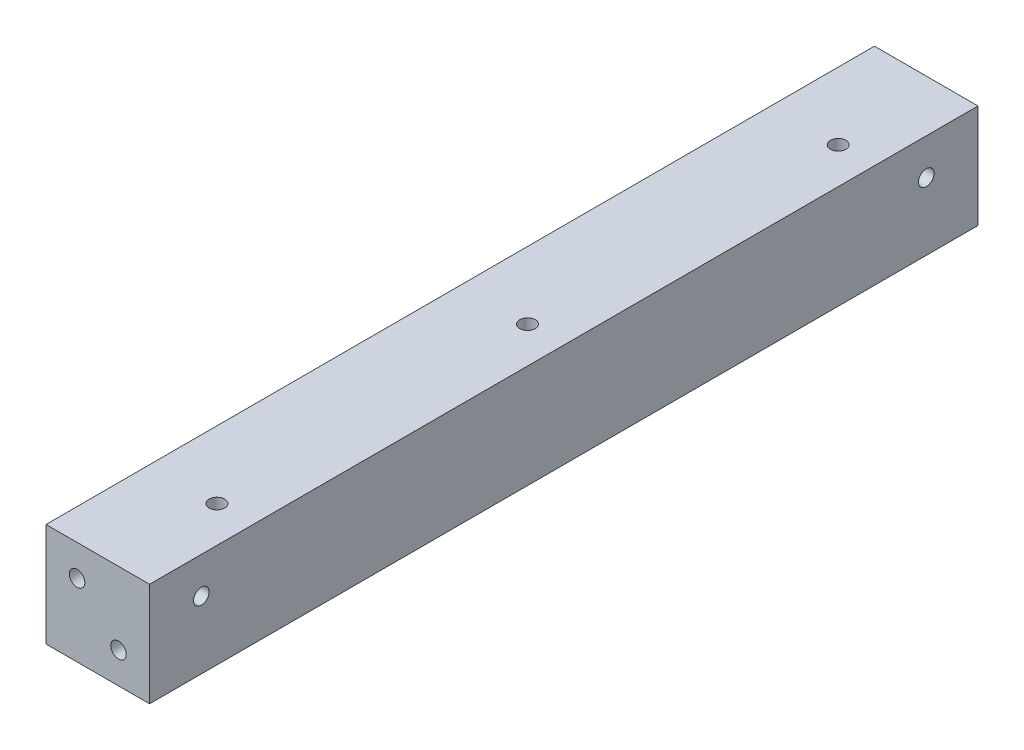
ISO-10303-21;
HEADER;
FILE_DESCRIPTION(('STEP AP214'),'2;1');
FILE_NAME('part.step','',(''),(''),'','','');
FILE_SCHEMA(('AUTOMOTIVE_DESIGN { 1 0 10303 214 1 1 1 1 }'));
ENDSEC;
DATA;
#1=APPLICATION_CONTEXT('core data for automotive mechanical design processes');
#2=APPLICATION_PROTOCOL_DEFINITION('international standard','automotive_design',2000,#1);
#3=PRODUCT_CONTEXT('',#1,'mechanical');
#4=PRODUCT('Part','Part','',(#3));
#5=PRODUCT_RELATED_PRODUCT_CATEGORY('part','',(#4));
#6=PRODUCT_DEFINITION_FORMATION('','',#4);
#7=PRODUCT_DEFINITION_CONTEXT('part definition',#1,'design');
#8=PRODUCT_DEFINITION('design','',#6,#7);
#9=PRODUCT_DEFINITION_SHAPE('','',#8);
#10=(LENGTH_UNIT() NAMED_UNIT(*) SI_UNIT(.MILLI.,.METRE.));
#11=(NAMED_UNIT(*) PLANE_ANGLE_UNIT() SI_UNIT($,.RADIAN.));
#12=(NAMED_UNIT(*) SI_UNIT($,.STERADIAN.) SOLID_ANGLE_UNIT());
#13=UNCERTAINTY_MEASURE_WITH_UNIT(LENGTH_MEASURE(1.E-05),#10,'distance_accuracy_value','');
#14=(GEOMETRIC_REPRESENTATION_CONTEXT(3) GLOBAL_UNCERTAINTY_ASSIGNED_CONTEXT((#13)) GLOBAL_UNIT_ASSIGNED_CONTEXT((#10,
#11,#12)) REPRESENTATION_CONTEXT('',''));
#15=CARTESIAN_POINT('',(0.,0.,0.));
#16=DIRECTION('',(0.,0.,1.));
#17=DIRECTION('',(1.,0.,0.));
#18=AXIS2_PLACEMENT_3D('',#15,#16,#17);
#19=CARTESIAN_POINT('',(0.,0.,160.));
#20=DIRECTION('',(1.,0.,0.));
#21=DIRECTION('',(0.,0.,-1.));
#22=AXIS2_PLACEMENT_3D('',#19,#20,#21);
#23=PLANE('',#22);
#24=CARTESIAN_POINT('',(0.,6.99999999999998,20.));
#25=DIRECTION('',(-1.,0.,0.));
#26=DIRECTION('',(0.,0.,1.));
#27=AXIS2_PLACEMENT_3D('',#24,#25,#26);
#28=CIRCLE('',#27,1.5);
#29=CARTESIAN_POINT('',(0.,6.99999999999998,21.5));
#30=VERTEX_POINT('',#29);
#31=EDGE_CURVE('E196',#30,#30,#28,.T.);
#32=ORIENTED_EDGE('',*,*,#31,.F.);
#33=EDGE_LOOP('',(#32));
#34=FACE_BOUND('',#33,.T.);
#35=CARTESIAN_POINT('',(0.,6.99999999999998,80.));
#36=DIRECTION('',(-1.,0.,0.));
#37=DIRECTION('',(0.,0.,1.));
#38=AXIS2_PLACEMENT_3D('',#35,#36,#37);
#39=CIRCLE('',#38,1.5);
#40=CARTESIAN_POINT('',(0.,6.99999999999998,81.5));
#41=VERTEX_POINT('',#40);
#42=EDGE_CURVE('E190',#41,#41,#39,.T.);
#43=ORIENTED_EDGE('',*,*,#42,.F.);
#44=EDGE_LOOP('',(#43));
#45=FACE_BOUND('',#44,.T.);
#46=CARTESIAN_POINT('',(0.,6.99999999999998,140.));
#47=DIRECTION('',(-1.,0.,0.));
#48=DIRECTION('',(0.,0.,1.));
#49=AXIS2_PLACEMENT_3D('',#46,#47,#48);
#50=CIRCLE('',#49,1.5);
#51=CARTESIAN_POINT('',(0.,6.99999999999998,141.5));
#52=VERTEX_POINT('',#51);
#53=EDGE_CURVE('E184',#52,#52,#50,.T.);
#54=ORIENTED_EDGE('',*,*,#53,.F.);
#55=EDGE_LOOP('',(#54));
#56=FACE_BOUND('',#55,.T.);
#57=DIRECTION('',(0.,-1.,0.));
#58=VECTOR('',#57,1.);
#59=CARTESIAN_POINT('',(0.,0.,0.));
#60=LINE('',#59,#58);
#61=CARTESIAN_POINT('',(0.,20.,0.));
#62=VERTEX_POINT('',#61);
#63=CARTESIAN_POINT('',(0.,0.,0.));
#64=VERTEX_POINT('',#63);
#65=EDGE_CURVE('E104',#62,#64,#60,.T.);
#66=ORIENTED_EDGE('',*,*,#65,.T.);
#67=DIRECTION('',(0.,0.,-1.));
#68=VECTOR('',#67,1.);
#69=CARTESIAN_POINT('',(0.,0.,160.));
#70=LINE('',#69,#68);
#71=CARTESIAN_POINT('',(0.,0.,160.));
#72=VERTEX_POINT('',#71);
#73=EDGE_CURVE('E11',#72,#64,#70,.T.);
#74=ORIENTED_EDGE('',*,*,#73,.F.);
#75=DIRECTION('',(0.,-1.,0.));
#76=VECTOR('',#75,1.);
#77=CARTESIAN_POINT('',(0.,0.,160.));
#78=LINE('',#77,#76);
#79=CARTESIAN_POINT('',(0.,20.,160.));
#80=VERTEX_POINT('',#79);
#81=EDGE_CURVE('E92',#80,#72,#78,.T.);
#82=ORIENTED_EDGE('',*,*,#81,.F.);
#83=DIRECTION('',(0.,0.,-1.));
#84=VECTOR('',#83,1.);
#85=CARTESIAN_POINT('',(0.,20.,160.));
#86=LINE('',#85,#84);
#87=EDGE_CURVE('E100',#80,#62,#86,.T.);
#88=ORIENTED_EDGE('',*,*,#87,.T.);
#89=EDGE_LOOP('',(#66,#74,#82,#88));
#90=FACE_BOUND('',#89,.T.);
#91=ADVANCED_FACE('F41',(#34,#45,#56,#90),#23,.F.);
#92=CARTESIAN_POINT('',(0.,0.,160.));
#93=DIRECTION('',(0.,1.,0.));
#94=DIRECTION('',(0.,0.,1.));
#95=AXIS2_PLACEMENT_3D('',#92,#93,#94);
#96=PLANE('',#95);
#97=CARTESIAN_POINT('',(7.,0.,10.));
#98=DIRECTION('',(0.,-1.,0.));
#99=DIRECTION('',(0.,0.,-1.));
#100=AXIS2_PLACEMENT_3D('',#97,#98,#99);
#101=CIRCLE('',#100,1.5);
#102=CARTESIAN_POINT('',(7.,0.,8.5));
#103=VERTEX_POINT('',#102);
#104=EDGE_CURVE('E161',#103,#103,#101,.T.);
#105=ORIENTED_EDGE('',*,*,#104,.F.);
#106=EDGE_LOOP('',(#105));
#107=FACE_BOUND('',#106,.T.);
#108=CARTESIAN_POINT('',(7.,0.,150.));
#109=DIRECTION('',(0.,-1.,0.));
#110=DIRECTION('',(0.,0.,-1.));
#111=AXIS2_PLACEMENT_3D('',#108,#109,#110);
#112=CIRCLE('',#111,1.5);
#113=CARTESIAN_POINT('',(7.,0.,148.5));
#114=VERTEX_POINT('',#113);
#115=EDGE_CURVE('E154',#114,#114,#112,.T.);
#116=ORIENTED_EDGE('',*,*,#115,.F.);
#117=EDGE_LOOP('',(#116));
#118=FACE_BOUND('',#117,.T.);
#119=DIRECTION('',(1.,0.,0.));
#120=VECTOR('',#119,1.);
#121=CARTESIAN_POINT('',(0.,0.,0.));
#122=LINE('',#121,#120);
#123=CARTESIAN_POINT('',(20.,0.,0.));
#124=VERTEX_POINT('',#123);
#125=EDGE_CURVE('E96',#64,#124,#122,.T.);
#126=ORIENTED_EDGE('',*,*,#125,.T.);
#127=DIRECTION('',(0.,0.,-1.));
#128=VECTOR('',#127,1.);
#129=CARTESIAN_POINT('',(20.,0.,160.));
#130=LINE('',#129,#128);
#131=CARTESIAN_POINT('',(20.,0.,160.));
#132=VERTEX_POINT('',#131);
#133=EDGE_CURVE('E49',#132,#124,#130,.T.);
#134=ORIENTED_EDGE('',*,*,#133,.F.);
#135=DIRECTION('',(1.,0.,0.));
#136=VECTOR('',#135,1.);
#137=CARTESIAN_POINT('',(0.,0.,160.));
#138=LINE('',#137,#136);
#139=EDGE_CURVE('E87',#72,#132,#138,.T.);
#140=ORIENTED_EDGE('',*,*,#139,.F.);
#141=ORIENTED_EDGE('',*,*,#73,.T.);
#142=EDGE_LOOP('',(#126,#134,#140,#141));
#143=FACE_BOUND('',#142,.T.);
#144=ADVANCED_FACE('F95',(#107,#118,#143),#96,.F.);
#145=CARTESIAN_POINT('',(20.,0.,160.));
#146=DIRECTION('',(-1.,0.,0.));
#147=DIRECTION('',(0.,0.,1.));
#148=AXIS2_PLACEMENT_3D('',#145,#146,#147);
#149=PLANE('',#148);
#150=CARTESIAN_POINT('',(20.,13.,10.));
#151=DIRECTION('',(1.,0.,0.));
#152=DIRECTION('',(0.,0.,-1.));
#153=AXIS2_PLACEMENT_3D('',#150,#151,#152);
#154=CIRCLE('',#153,1.5);
#155=CARTESIAN_POINT('',(20.,13.,8.5));
#156=VERTEX_POINT('',#155);
#157=EDGE_CURVE('E149',#156,#156,#154,.T.);
#158=ORIENTED_EDGE('',*,*,#157,.F.);
#159=EDGE_LOOP('',(#158));
#160=FACE_BOUND('',#159,.T.);
#161=CARTESIAN_POINT('',(20.,13.,150.));
#162=DIRECTION('',(1.,0.,0.));
#163=DIRECTION('',(0.,0.,-1.));
#164=AXIS2_PLACEMENT_3D('',#161,#162,#163);
#165=CIRCLE('',#164,1.5);
#166=CARTESIAN_POINT('',(20.,13.,148.5));
#167=VERTEX_POINT('',#166);
#168=EDGE_CURVE('E142',#167,#167,#165,.T.);
#169=ORIENTED_EDGE('',*,*,#168,.F.);
#170=EDGE_LOOP('',(#169));
#171=FACE_BOUND('',#170,.T.);
#172=DIRECTION('',(0.,1.,0.));
#173=VECTOR('',#172,1.);
#174=CARTESIAN_POINT('',(20.,0.,0.));
#175=LINE('',#174,#173);
#176=CARTESIAN_POINT('',(20.,20.,0.));
#177=VERTEX_POINT('',#176);
#178=EDGE_CURVE('E74',#124,#177,#175,.T.);
#179=ORIENTED_EDGE('',*,*,#178,.T.);
#180=DIRECTION('',(0.,0.,-1.));
#181=VECTOR('',#180,1.);
#182=CARTESIAN_POINT('',(20.,20.,160.));
#183=LINE('',#182,#181);
#184=CARTESIAN_POINT('',(20.,20.,160.));
#185=VERTEX_POINT('',#184);
#186=EDGE_CURVE('E97',#185,#177,#183,.T.);
#187=ORIENTED_EDGE('',*,*,#186,.F.);
#188=DIRECTION('',(0.,1.,0.));
#189=VECTOR('',#188,1.);
#190=CARTESIAN_POINT('',(20.,0.,160.));
#191=LINE('',#190,#189);
#192=EDGE_CURVE('E90',#132,#185,#191,.T.);
#193=ORIENTED_EDGE('',*,*,#192,.F.);
#194=ORIENTED_EDGE('',*,*,#133,.T.);
#195=EDGE_LOOP('',(#179,#187,#193,#194));
#196=FACE_BOUND('',#195,.T.);
#197=ADVANCED_FACE('F98',(#160,#171,#196),#149,.F.);
#198=CARTESIAN_POINT('',(0.,20.,160.));
#199=DIRECTION('',(0.,-1.,0.));
#200=DIRECTION('',(0.,0.,-1.));
#201=AXIS2_PLACEMENT_3D('',#198,#199,#200);
#202=PLANE('',#201);
#203=CARTESIAN_POINT('',(13.,20.,20.));
#204=DIRECTION('',(0.,1.,0.));
#205=DIRECTION('',(0.,0.,1.));
#206=AXIS2_PLACEMENT_3D('',#203,#204,#205);
#207=CIRCLE('',#206,1.5);
#208=CARTESIAN_POINT('',(13.,20.,21.5));
#209=VERTEX_POINT('',#208);
#210=EDGE_CURVE('E179',#209,#209,#207,.T.);
#211=ORIENTED_EDGE('',*,*,#210,.F.);
#212=EDGE_LOOP('',(#211));
#213=FACE_BOUND('',#212,.T.);
#214=CARTESIAN_POINT('',(13.,20.,80.));
#215=DIRECTION('',(0.,1.,0.));
#216=DIRECTION('',(0.,0.,1.));
#217=AXIS2_PLACEMENT_3D('',#214,#215,#216);
#218=CIRCLE('',#217,1.5);
#219=CARTESIAN_POINT('',(13.,20.,81.5));
#220=VERTEX_POINT('',#219);
#221=EDGE_CURVE('E173',#220,#220,#218,.T.);
#222=ORIENTED_EDGE('',*,*,#221,.F.);
#223=EDGE_LOOP('',(#222));
#224=FACE_BOUND('',#223,.T.);
#225=CARTESIAN_POINT('',(13.,20.,140.));
#226=DIRECTION('',(0.,1.,0.));
#227=DIRECTION('',(0.,0.,1.));
#228=AXIS2_PLACEMENT_3D('',#225,#226,#227);
#229=CIRCLE('',#228,1.5);
#230=CARTESIAN_POINT('',(13.,20.,141.5));
#231=VERTEX_POINT('',#230);
#232=EDGE_CURVE('E166',#231,#231,#229,.T.);
#233=ORIENTED_EDGE('',*,*,#232,.F.);
#234=EDGE_LOOP('',(#233));
#235=FACE_BOUND('',#234,.T.);
#236=DIRECTION('',(-1.,0.,0.));
#237=VECTOR('',#236,1.);
#238=CARTESIAN_POINT('',(0.,20.,0.));
#239=LINE('',#238,#237);
#240=EDGE_CURVE('E80',#177,#62,#239,.T.);
#241=ORIENTED_EDGE('',*,*,#240,.T.);
#242=ORIENTED_EDGE('',*,*,#87,.F.);
#243=DIRECTION('',(-1.,0.,0.));
#244=VECTOR('',#243,1.);
#245=CARTESIAN_POINT('',(0.,20.,160.));
#246=LINE('',#245,#244);
#247=EDGE_CURVE('E57',#185,#80,#246,.T.);
#248=ORIENTED_EDGE('',*,*,#247,.F.);
#249=ORIENTED_EDGE('',*,*,#186,.T.);
#250=EDGE_LOOP('',(#241,#242,#248,#249));
#251=FACE_BOUND('',#250,.T.);
#252=ADVANCED_FACE('F112',(#213,#224,#235,#251),#202,.F.);
#253=CARTESIAN_POINT('',(0.,0.,160.));
#254=DIRECTION('',(0.,0.,-1.));
#255=DIRECTION('',(-1.,0.,0.));
#256=AXIS2_PLACEMENT_3D('',#253,#254,#255);
#257=PLANE('',#256);
#258=CARTESIAN_POINT('',(6.,14.,160.));
#259=DIRECTION('',(0.,0.,1.));
#260=DIRECTION('',(1.,0.,0.));
#261=AXIS2_PLACEMENT_3D('',#258,#259,#260);
#262=CIRCLE('',#261,1.5);
#263=CARTESIAN_POINT('',(7.5,14.,160.));
#264=VERTEX_POINT('',#263);
#265=EDGE_CURVE('E125',#264,#264,#262,.T.);
#266=ORIENTED_EDGE('',*,*,#265,.F.);
#267=EDGE_LOOP('',(#266));
#268=FACE_BOUND('',#267,.T.);
#269=CARTESIAN_POINT('',(14.,6.,160.));
#270=DIRECTION('',(0.,0.,1.));
#271=DIRECTION('',(1.,0.,0.));
#272=AXIS2_PLACEMENT_3D('',#269,#270,#271);
#273=CIRCLE('',#272,1.5);
#274=CARTESIAN_POINT('',(15.5,6.,160.));
#275=VERTEX_POINT('',#274);
#276=EDGE_CURVE('E118',#275,#275,#273,.T.);
#277=ORIENTED_EDGE('',*,*,#276,.F.);
#278=EDGE_LOOP('',(#277));
#279=FACE_BOUND('',#278,.T.);
#280=ORIENTED_EDGE('',*,*,#81,.T.);
#281=ORIENTED_EDGE('',*,*,#139,.T.);
#282=ORIENTED_EDGE('',*,*,#192,.T.);
#283=ORIENTED_EDGE('',*,*,#247,.T.);
#284=EDGE_LOOP('',(#280,#281,#282,#283));
#285=FACE_BOUND('',#284,.T.);
#286=ADVANCED_FACE('F88',(#268,#279,#285),#257,.F.);
#287=CARTESIAN_POINT('',(0.,0.,0.));
#288=DIRECTION('',(0.,0.,-1.));
#289=DIRECTION('',(-1.,0.,0.));
#290=AXIS2_PLACEMENT_3D('',#287,#288,#289);
#291=PLANE('',#290);
#292=CARTESIAN_POINT('',(14.,6.,0.));
#293=DIRECTION('',(0.,0.,-1.));
#294=DIRECTION('',(-1.,0.,0.));
#295=AXIS2_PLACEMENT_3D('',#292,#293,#294);
#296=CIRCLE('',#295,1.5);
#297=CARTESIAN_POINT('',(12.5,6.,0.));
#298=VERTEX_POINT('',#297);
#299=EDGE_CURVE('E137',#298,#298,#296,.T.);
#300=ORIENTED_EDGE('',*,*,#299,.F.);
#301=EDGE_LOOP('',(#300));
#302=FACE_BOUND('',#301,.T.);
#303=CARTESIAN_POINT('',(6.,14.,0.));
#304=DIRECTION('',(0.,0.,-1.));
#305=DIRECTION('',(-1.,0.,0.));
#306=AXIS2_PLACEMENT_3D('',#303,#304,#305);
#307=CIRCLE('',#306,1.5);
#308=CARTESIAN_POINT('',(4.5,14.,0.));
#309=VERTEX_POINT('',#308);
#310=EDGE_CURVE('E130',#309,#309,#307,.T.);
#311=ORIENTED_EDGE('',*,*,#310,.F.);
#312=EDGE_LOOP('',(#311));
#313=FACE_BOUND('',#312,.T.);
#314=ORIENTED_EDGE('',*,*,#65,.F.);
#315=ORIENTED_EDGE('',*,*,#240,.F.);
#316=ORIENTED_EDGE('',*,*,#178,.F.);
#317=ORIENTED_EDGE('',*,*,#125,.F.);
#318=EDGE_LOOP('',(#314,#315,#316,#317));
#319=FACE_BOUND('',#318,.T.);
#320=ADVANCED_FACE('F115',(#302,#313,#319),#291,.T.);
#321=CARTESIAN_POINT('',(14.,6.,150.));
#322=DIRECTION('',(0.,0.,1.));
#323=DIRECTION('',(1.,0.,0.));
#324=AXIS2_PLACEMENT_3D('',#321,#322,#323);
#325=CYLINDRICAL_SURFACE('',#324,1.5);
#326=CARTESIAN_POINT('',(14.,6.,150.));
#327=DIRECTION('',(0.,0.,1.));
#328=DIRECTION('',(1.,0.,0.));
#329=AXIS2_PLACEMENT_3D('',#326,#327,#328);
#330=CIRCLE('',#329,1.5);
#331=CARTESIAN_POINT('',(15.5,6.,150.));
#332=VERTEX_POINT('',#331);
#333=EDGE_CURVE('E121',#332,#332,#330,.T.);
#334=ORIENTED_EDGE('',*,*,#333,.F.);
#335=EDGE_LOOP('',(#334));
#336=FACE_BOUND('',#335,.T.);
#337=ORIENTED_EDGE('',*,*,#276,.T.);
#338=EDGE_LOOP('',(#337));
#339=FACE_BOUND('',#338,.T.);
#340=ADVANCED_FACE('F314',(#336,#339),#325,.F.);
#341=CARTESIAN_POINT('',(14.,6.,150.));
#342=DIRECTION('',(0.,0.,1.));
#343=DIRECTION('',(1.,0.,0.));
#344=AXIS2_PLACEMENT_3D('',#341,#342,#343);
#345=PLANE('',#344);
#346=ORIENTED_EDGE('',*,*,#333,.T.);
#347=EDGE_LOOP('',(#346));
#348=FACE_BOUND('',#347,.T.);
#349=ADVANCED_FACE('F310',(#348),#345,.T.);
#350=CARTESIAN_POINT('',(6.,14.,150.));
#351=DIRECTION('',(0.,0.,1.));
#352=DIRECTION('',(1.,0.,0.));
#353=AXIS2_PLACEMENT_3D('',#350,#351,#352);
#354=CYLINDRICAL_SURFACE('',#353,1.5);
#355=CARTESIAN_POINT('',(6.,14.,150.));
#356=DIRECTION('',(0.,0.,1.));
#357=DIRECTION('',(1.,0.,0.));
#358=AXIS2_PLACEMENT_3D('',#355,#356,#357);
#359=CIRCLE('',#358,1.5);
#360=CARTESIAN_POINT('',(7.5,14.,150.));
#361=VERTEX_POINT('',#360);
#362=EDGE_CURVE('E107',#361,#361,#359,.T.);
#363=ORIENTED_EDGE('',*,*,#362,.F.);
#364=EDGE_LOOP('',(#363));
#365=FACE_BOUND('',#364,.T.);
#366=ORIENTED_EDGE('',*,*,#265,.T.);
#367=EDGE_LOOP('',(#366));
#368=FACE_BOUND('',#367,.T.);
#369=ADVANCED_FACE('F306',(#365,#368),#354,.F.);
#370=CARTESIAN_POINT('',(6.,14.,150.));
#371=DIRECTION('',(0.,0.,1.));
#372=DIRECTION('',(1.,0.,0.));
#373=AXIS2_PLACEMENT_3D('',#370,#371,#372);
#374=PLANE('',#373);
#375=ORIENTED_EDGE('',*,*,#362,.T.);
#376=EDGE_LOOP('',(#375));
#377=FACE_BOUND('',#376,.T.);
#378=ADVANCED_FACE('F302',(#377),#374,.T.);
#379=CARTESIAN_POINT('',(6.,14.,10.));
#380=DIRECTION('',(0.,0.,-1.));
#381=DIRECTION('',(-1.,0.,0.));
#382=AXIS2_PLACEMENT_3D('',#379,#380,#381);
#383=CYLINDRICAL_SURFACE('',#382,1.5);
#384=CARTESIAN_POINT('',(6.,14.,10.));
#385=DIRECTION('',(0.,0.,-1.));
#386=DIRECTION('',(-1.,0.,0.));
#387=AXIS2_PLACEMENT_3D('',#384,#385,#386);
#388=CIRCLE('',#387,1.5);
#389=CARTESIAN_POINT('',(4.5,14.,10.));
#390=VERTEX_POINT('',#389);
#391=EDGE_CURVE('E133',#390,#390,#388,.T.);
#392=ORIENTED_EDGE('',*,*,#391,.F.);
#393=EDGE_LOOP('',(#392));
#394=FACE_BOUND('',#393,.T.);
#395=ORIENTED_EDGE('',*,*,#310,.T.);
#396=EDGE_LOOP('',(#395));
#397=FACE_BOUND('',#396,.T.);
#398=ADVANCED_FACE('F298',(#394,#397),#383,.F.);
#399=CARTESIAN_POINT('',(6.,14.,10.));
#400=DIRECTION('',(0.,0.,-1.));
#401=DIRECTION('',(-1.,0.,0.));
#402=AXIS2_PLACEMENT_3D('',#399,#400,#401);
#403=PLANE('',#402);
#404=ORIENTED_EDGE('',*,*,#391,.T.);
#405=EDGE_LOOP('',(#404));
#406=FACE_BOUND('',#405,.T.);
#407=ADVANCED_FACE('F294',(#406),#403,.T.);
#408=CARTESIAN_POINT('',(14.,6.,10.));
#409=DIRECTION('',(0.,0.,-1.));
#410=DIRECTION('',(-1.,0.,0.));
#411=AXIS2_PLACEMENT_3D('',#408,#409,#410);
#412=CYLINDRICAL_SURFACE('',#411,1.5);
#413=CARTESIAN_POINT('',(14.,6.,10.));
#414=DIRECTION('',(0.,0.,-1.));
#415=DIRECTION('',(-1.,0.,0.));
#416=AXIS2_PLACEMENT_3D('',#413,#414,#415);
#417=CIRCLE('',#416,1.5);
#418=CARTESIAN_POINT('',(12.5,6.,10.));
#419=VERTEX_POINT('',#418);
#420=EDGE_CURVE('E122',#419,#419,#417,.T.);
#421=ORIENTED_EDGE('',*,*,#420,.F.);
#422=EDGE_LOOP('',(#421));
#423=FACE_BOUND('',#422,.T.);
#424=ORIENTED_EDGE('',*,*,#299,.T.);
#425=EDGE_LOOP('',(#424));
#426=FACE_BOUND('',#425,.T.);
#427=ADVANCED_FACE('F290',(#423,#426),#412,.F.);
#428=CARTESIAN_POINT('',(14.,6.,10.));
#429=DIRECTION('',(0.,0.,-1.));
#430=DIRECTION('',(-1.,0.,0.));
#431=AXIS2_PLACEMENT_3D('',#428,#429,#430);
#432=PLANE('',#431);
#433=ORIENTED_EDGE('',*,*,#420,.T.);
#434=EDGE_LOOP('',(#433));
#435=FACE_BOUND('',#434,.T.);
#436=ADVANCED_FACE('F286',(#435),#432,.T.);
#437=CARTESIAN_POINT('',(10.,13.,150.));
#438=DIRECTION('',(1.,0.,0.));
#439=DIRECTION('',(0.,0.,-1.));
#440=AXIS2_PLACEMENT_3D('',#437,#438,#439);
#441=CYLINDRICAL_SURFACE('',#440,1.5);
#442=CARTESIAN_POINT('',(10.,13.,150.));
#443=DIRECTION('',(1.,0.,0.));
#444=DIRECTION('',(0.,0.,-1.));
#445=AXIS2_PLACEMENT_3D('',#442,#443,#444);
#446=CIRCLE('',#445,1.5);
#447=CARTESIAN_POINT('',(10.,13.,148.5));
#448=VERTEX_POINT('',#447);
#449=EDGE_CURVE('E145',#448,#448,#446,.T.);
#450=ORIENTED_EDGE('',*,*,#449,.F.);
#451=EDGE_LOOP('',(#450));
#452=FACE_BOUND('',#451,.T.);
#453=ORIENTED_EDGE('',*,*,#168,.T.);
#454=EDGE_LOOP('',(#453));
#455=FACE_BOUND('',#454,.T.);
#456=ADVANCED_FACE('F282',(#452,#455),#441,.F.);
#457=CARTESIAN_POINT('',(10.,13.,150.));
#458=DIRECTION('',(1.,0.,0.));
#459=DIRECTION('',(0.,0.,-1.));
#460=AXIS2_PLACEMENT_3D('',#457,#458,#459);
#461=PLANE('',#460);
#462=ORIENTED_EDGE('',*,*,#449,.T.);
#463=EDGE_LOOP('',(#462));
#464=FACE_BOUND('',#463,.T.);
#465=ADVANCED_FACE('F278',(#464),#461,.T.);
#466=CARTESIAN_POINT('',(10.,13.,10.));
#467=DIRECTION('',(1.,0.,0.));
#468=DIRECTION('',(0.,0.,-1.));
#469=AXIS2_PLACEMENT_3D('',#466,#467,#468);
#470=CYLINDRICAL_SURFACE('',#469,1.5);
#471=CARTESIAN_POINT('',(10.,13.,10.));
#472=DIRECTION('',(1.,0.,0.));
#473=DIRECTION('',(0.,0.,-1.));
#474=AXIS2_PLACEMENT_3D('',#471,#472,#473);
#475=CIRCLE('',#474,1.5);
#476=CARTESIAN_POINT('',(10.,13.,8.5));
#477=VERTEX_POINT('',#476);
#478=EDGE_CURVE('E134',#477,#477,#475,.T.);
#479=ORIENTED_EDGE('',*,*,#478,.F.);
#480=EDGE_LOOP('',(#479));
#481=FACE_BOUND('',#480,.T.);
#482=ORIENTED_EDGE('',*,*,#157,.T.);
#483=EDGE_LOOP('',(#482));
#484=FACE_BOUND('',#483,.T.);
#485=ADVANCED_FACE('F274',(#481,#484),#470,.F.);
#486=CARTESIAN_POINT('',(10.,13.,10.));
#487=DIRECTION('',(1.,0.,0.));
#488=DIRECTION('',(0.,0.,-1.));
#489=AXIS2_PLACEMENT_3D('',#486,#487,#488);
#490=PLANE('',#489);
#491=ORIENTED_EDGE('',*,*,#478,.T.);
#492=EDGE_LOOP('',(#491));
#493=FACE_BOUND('',#492,.T.);
#494=ADVANCED_FACE('F270',(#493),#490,.T.);
#495=CARTESIAN_POINT('',(7.,10.,150.));
#496=DIRECTION('',(0.,-1.,0.));
#497=DIRECTION('',(0.,0.,-1.));
#498=AXIS2_PLACEMENT_3D('',#495,#496,#497);
#499=CYLINDRICAL_SURFACE('',#498,1.5);
#500=CARTESIAN_POINT('',(7.,10.,150.));
#501=DIRECTION('',(0.,-1.,0.));
#502=DIRECTION('',(0.,0.,-1.));
#503=AXIS2_PLACEMENT_3D('',#500,#501,#502);
#504=CIRCLE('',#503,1.5);
#505=CARTESIAN_POINT('',(7.,10.,148.5));
#506=VERTEX_POINT('',#505);
#507=EDGE_CURVE('E157',#506,#506,#504,.T.);
#508=ORIENTED_EDGE('',*,*,#507,.F.);
#509=EDGE_LOOP('',(#508));
#510=FACE_BOUND('',#509,.T.);
#511=ORIENTED_EDGE('',*,*,#115,.T.);
#512=EDGE_LOOP('',(#511));
#513=FACE_BOUND('',#512,.T.);
#514=ADVANCED_FACE('F266',(#510,#513),#499,.F.);
#515=CARTESIAN_POINT('',(7.,10.,150.));
#516=DIRECTION('',(0.,-1.,0.));
#517=DIRECTION('',(0.,0.,-1.));
#518=AXIS2_PLACEMENT_3D('',#515,#516,#517);
#519=PLANE('',#518);
#520=ORIENTED_EDGE('',*,*,#507,.T.);
#521=EDGE_LOOP('',(#520));
#522=FACE_BOUND('',#521,.T.);
#523=ADVANCED_FACE('F262',(#522),#519,.T.);
#524=CARTESIAN_POINT('',(7.,10.,10.));
#525=DIRECTION('',(0.,-1.,0.));
#526=DIRECTION('',(0.,0.,-1.));
#527=AXIS2_PLACEMENT_3D('',#524,#525,#526);
#528=CYLINDRICAL_SURFACE('',#527,1.5);
#529=CARTESIAN_POINT('',(7.,10.,10.));
#530=DIRECTION('',(0.,-1.,0.));
#531=DIRECTION('',(0.,0.,-1.));
#532=AXIS2_PLACEMENT_3D('',#529,#530,#531);
#533=CIRCLE('',#532,1.5);
#534=CARTESIAN_POINT('',(7.,10.,8.5));
#535=VERTEX_POINT('',#534);
#536=EDGE_CURVE('E146',#535,#535,#533,.T.);
#537=ORIENTED_EDGE('',*,*,#536,.F.);
#538=EDGE_LOOP('',(#537));
#539=FACE_BOUND('',#538,.T.);
#540=ORIENTED_EDGE('',*,*,#104,.T.);
#541=EDGE_LOOP('',(#540));
#542=FACE_BOUND('',#541,.T.);
#543=ADVANCED_FACE('F258',(#539,#542),#528,.F.);
#544=CARTESIAN_POINT('',(7.,10.,10.));
#545=DIRECTION('',(0.,-1.,0.));
#546=DIRECTION('',(0.,0.,-1.));
#547=AXIS2_PLACEMENT_3D('',#544,#545,#546);
#548=PLANE('',#547);
#549=ORIENTED_EDGE('',*,*,#536,.T.);
#550=EDGE_LOOP('',(#549));
#551=FACE_BOUND('',#550,.T.);
#552=ADVANCED_FACE('F254',(#551),#548,.T.);
#553=CARTESIAN_POINT('',(13.,10.,140.));
#554=DIRECTION('',(0.,1.,0.));
#555=DIRECTION('',(0.,0.,1.));
#556=AXIS2_PLACEMENT_3D('',#553,#554,#555);
#557=CYLINDRICAL_SURFACE('',#556,1.5);
#558=CARTESIAN_POINT('',(13.,10.,140.));
#559=DIRECTION('',(0.,1.,0.));
#560=DIRECTION('',(0.,0.,1.));
#561=AXIS2_PLACEMENT_3D('',#558,#559,#560);
#562=CIRCLE('',#561,1.5);
#563=CARTESIAN_POINT('',(13.,10.,141.5));
#564=VERTEX_POINT('',#563);
#565=EDGE_CURVE('E169',#564,#564,#562,.T.);
#566=ORIENTED_EDGE('',*,*,#565,.F.);
#567=EDGE_LOOP('',(#566));
#568=FACE_BOUND('',#567,.T.);
#569=ORIENTED_EDGE('',*,*,#232,.T.);
#570=EDGE_LOOP('',(#569));
#571=FACE_BOUND('',#570,.T.);
#572=ADVANCED_FACE('F250',(#568,#571),#557,.F.);
#573=CARTESIAN_POINT('',(13.,10.,140.));
#574=DIRECTION('',(0.,1.,0.));
#575=DIRECTION('',(0.,0.,1.));
#576=AXIS2_PLACEMENT_3D('',#573,#574,#575);
#577=PLANE('',#576);
#578=ORIENTED_EDGE('',*,*,#565,.T.);
#579=EDGE_LOOP('',(#578));
#580=FACE_BOUND('',#579,.T.);
#581=ADVANCED_FACE('F246',(#580),#577,.T.);
#582=CARTESIAN_POINT('',(13.,10.,80.));
#583=DIRECTION('',(0.,1.,0.));
#584=DIRECTION('',(0.,0.,1.));
#585=AXIS2_PLACEMENT_3D('',#582,#583,#584);
#586=CYLINDRICAL_SURFACE('',#585,1.5);
#587=CARTESIAN_POINT('',(13.,10.,80.));
#588=DIRECTION('',(0.,1.,0.));
#589=DIRECTION('',(0.,0.,1.));
#590=AXIS2_PLACEMENT_3D('',#587,#588,#589);
#591=CIRCLE('',#590,1.5);
#592=CARTESIAN_POINT('',(13.,10.,81.5));
#593=VERTEX_POINT('',#592);
#594=EDGE_CURVE('E176',#593,#593,#591,.T.);
#595=ORIENTED_EDGE('',*,*,#594,.F.);
#596=EDGE_LOOP('',(#595));
#597=FACE_BOUND('',#596,.T.);
#598=ORIENTED_EDGE('',*,*,#221,.T.);
#599=EDGE_LOOP('',(#598));
#600=FACE_BOUND('',#599,.T.);
#601=ADVANCED_FACE('F242',(#597,#600),#586,.F.);
#602=CARTESIAN_POINT('',(13.,10.,80.));
#603=DIRECTION('',(0.,1.,0.));
#604=DIRECTION('',(0.,0.,1.));
#605=AXIS2_PLACEMENT_3D('',#602,#603,#604);
#606=PLANE('',#605);
#607=ORIENTED_EDGE('',*,*,#594,.T.);
#608=EDGE_LOOP('',(#607));
#609=FACE_BOUND('',#608,.T.);
#610=ADVANCED_FACE('F238',(#609),#606,.T.);
#611=CARTESIAN_POINT('',(13.,10.,20.));
#612=DIRECTION('',(0.,1.,0.));
#613=DIRECTION('',(0.,0.,1.));
#614=AXIS2_PLACEMENT_3D('',#611,#612,#613);
#615=CYLINDRICAL_SURFACE('',#614,1.5);
#616=CARTESIAN_POINT('',(13.,10.,20.));
#617=DIRECTION('',(0.,1.,0.));
#618=DIRECTION('',(0.,0.,1.));
#619=AXIS2_PLACEMENT_3D('',#616,#617,#618);
#620=CIRCLE('',#619,1.5);
#621=CARTESIAN_POINT('',(13.,10.,21.5));
#622=VERTEX_POINT('',#621);
#623=EDGE_CURVE('E158',#622,#622,#620,.T.);
#624=ORIENTED_EDGE('',*,*,#623,.F.);
#625=EDGE_LOOP('',(#624));
#626=FACE_BOUND('',#625,.T.);
#627=ORIENTED_EDGE('',*,*,#210,.T.);
#628=EDGE_LOOP('',(#627));
#629=FACE_BOUND('',#628,.T.);
#630=ADVANCED_FACE('F230',(#626,#629),#615,.F.);
#631=CARTESIAN_POINT('',(13.,10.,20.));
#632=DIRECTION('',(0.,1.,0.));
#633=DIRECTION('',(0.,0.,1.));
#634=AXIS2_PLACEMENT_3D('',#631,#632,#633);
#635=PLANE('',#634);
#636=ORIENTED_EDGE('',*,*,#623,.T.);
#637=EDGE_LOOP('',(#636));
#638=FACE_BOUND('',#637,.T.);
#639=ADVANCED_FACE('F220',(#638),#635,.T.);
#640=CARTESIAN_POINT('',(10.,6.99999999999998,140.));
#641=DIRECTION('',(-1.,0.,0.));
#642=DIRECTION('',(0.,0.,1.));
#643=AXIS2_PLACEMENT_3D('',#640,#641,#642);
#644=CYLINDRICAL_SURFACE('',#643,1.5);
#645=CARTESIAN_POINT('',(10.,6.99999999999998,140.));
#646=DIRECTION('',(-1.,0.,0.));
#647=DIRECTION('',(0.,0.,1.));
#648=AXIS2_PLACEMENT_3D('',#645,#646,#647);
#649=CIRCLE('',#648,1.5);
#650=CARTESIAN_POINT('',(10.,6.99999999999998,141.5));
#651=VERTEX_POINT('',#650);
#652=EDGE_CURVE('E187',#651,#651,#649,.T.);
#653=ORIENTED_EDGE('',*,*,#652,.F.);
#654=EDGE_LOOP('',(#653));
#655=FACE_BOUND('',#654,.T.);
#656=ORIENTED_EDGE('',*,*,#53,.T.);
#657=EDGE_LOOP('',(#656));
#658=FACE_BOUND('',#657,.T.);
#659=ADVANCED_FACE('F217',(#655,#658),#644,.F.);
#660=CARTESIAN_POINT('',(10.,6.99999999999998,140.));
#661=DIRECTION('',(-1.,0.,0.));
#662=DIRECTION('',(0.,0.,1.));
#663=AXIS2_PLACEMENT_3D('',#660,#661,#662);
#664=PLANE('',#663);
#665=ORIENTED_EDGE('',*,*,#652,.T.);
#666=EDGE_LOOP('',(#665));
#667=FACE_BOUND('',#666,.T.);
#668=ADVANCED_FACE('F219',(#667),#664,.T.);
#669=CARTESIAN_POINT('',(10.,6.99999999999998,80.));
#670=DIRECTION('',(-1.,0.,0.));
#671=DIRECTION('',(0.,0.,1.));
#672=AXIS2_PLACEMENT_3D('',#669,#670,#671);
#673=CYLINDRICAL_SURFACE('',#672,1.5);
#674=CARTESIAN_POINT('',(10.,6.99999999999998,80.));
#675=DIRECTION('',(-1.,0.,0.));
#676=DIRECTION('',(0.,0.,1.));
#677=AXIS2_PLACEMENT_3D('',#674,#675,#676);
#678=CIRCLE('',#677,1.5);
#679=CARTESIAN_POINT('',(10.,6.99999999999998,81.5));
#680=VERTEX_POINT('',#679);
#681=EDGE_CURVE('E193',#680,#680,#678,.T.);
#682=ORIENTED_EDGE('',*,*,#681,.F.);
#683=EDGE_LOOP('',(#682));
#684=FACE_BOUND('',#683,.T.);
#685=ORIENTED_EDGE('',*,*,#42,.T.);
#686=EDGE_LOOP('',(#685));
#687=FACE_BOUND('',#686,.T.);
#688=ADVANCED_FACE('F227',(#684,#687),#673,.F.);
#689=CARTESIAN_POINT('',(10.,6.99999999999998,80.));
#690=DIRECTION('',(-1.,0.,0.));
#691=DIRECTION('',(0.,0.,1.));
#692=AXIS2_PLACEMENT_3D('',#689,#690,#691);
#693=PLANE('',#692);
#694=ORIENTED_EDGE('',*,*,#681,.T.);
#695=EDGE_LOOP('',(#694));
#696=FACE_BOUND('',#695,.T.);
#697=ADVANCED_FACE('F207',(#696),#693,.T.);
#698=CARTESIAN_POINT('',(10.,6.99999999999998,20.));
#699=DIRECTION('',(-1.,0.,0.));
#700=DIRECTION('',(0.,0.,1.));
#701=AXIS2_PLACEMENT_3D('',#698,#699,#700);
#702=CYLINDRICAL_SURFACE('',#701,1.5);
#703=CARTESIAN_POINT('',(10.,6.99999999999998,20.));
#704=DIRECTION('',(-1.,0.,0.));
#705=DIRECTION('',(0.,0.,1.));
#706=AXIS2_PLACEMENT_3D('',#703,#704,#705);
#707=CIRCLE('',#706,1.5);
#708=CARTESIAN_POINT('',(10.,6.99999999999998,21.5));
#709=VERTEX_POINT('',#708);
#710=EDGE_CURVE('E170',#709,#709,#707,.T.);
#711=ORIENTED_EDGE('',*,*,#710,.F.);
#712=EDGE_LOOP('',(#711));
#713=FACE_BOUND('',#712,.T.);
#714=ORIENTED_EDGE('',*,*,#31,.T.);
#715=EDGE_LOOP('',(#714));
#716=FACE_BOUND('',#715,.T.);
#717=ADVANCED_FACE('F204',(#713,#716),#702,.F.);
#718=CARTESIAN_POINT('',(10.,6.99999999999998,20.));
#719=DIRECTION('',(-1.,0.,0.));
#720=DIRECTION('',(0.,0.,1.));
#721=AXIS2_PLACEMENT_3D('',#718,#719,#720);
#722=PLANE('',#721);
#723=ORIENTED_EDGE('',*,*,#710,.T.);
#724=EDGE_LOOP('',(#723));
#725=FACE_BOUND('',#724,.T.);
#726=ADVANCED_FACE('F202',(#725),#722,.T.);
#727=CLOSED_SHELL('',(#91,#144,#197,#252,#286,#320,#340,#349,#369,#378,#398,#407,#427,#436,#456,
#465,#485,#494,#514,#523,#543,#552,#572,#581,#601,#610,#630,#639,#659,#668,#688,#697,#717,#726));
#728=MANIFOLD_SOLID_BREP('B2',#727);
#729=ADVANCED_BREP_SHAPE_REPRESENTATION('',(#18,#728),#14);
#730=SHAPE_DEFINITION_REPRESENTATION(#9,#729);
ENDSEC;
END-ISO-10303-21;
